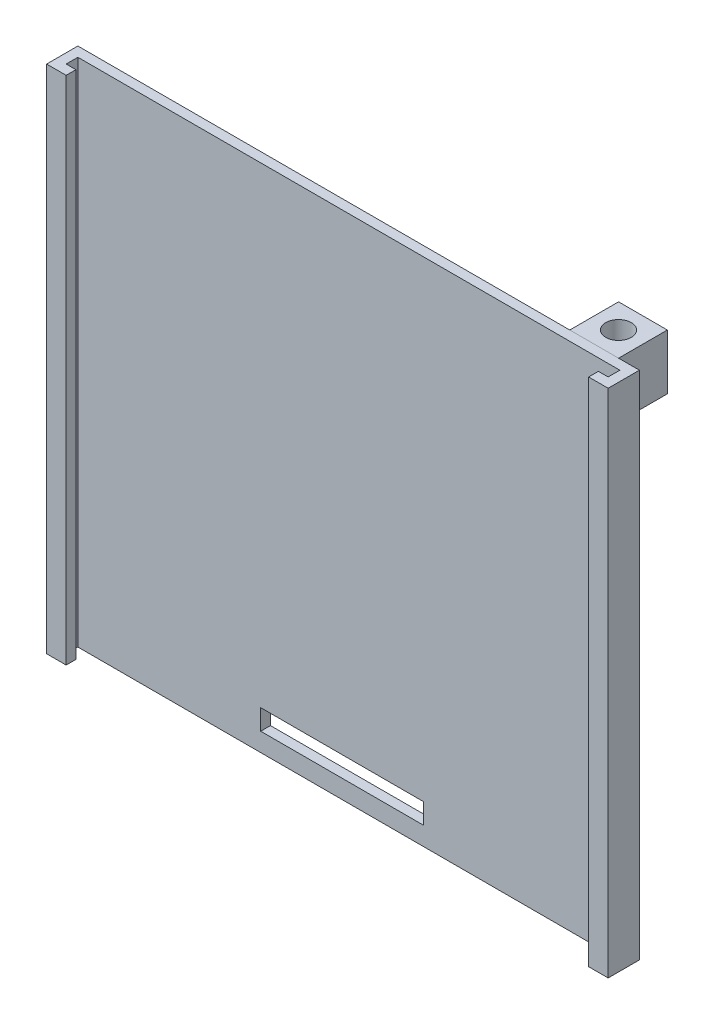
ISO-10303-21;
HEADER;
FILE_DESCRIPTION(('STEP AP214'),'2;1');
FILE_NAME('part.step','',(''),(''),'','','');
FILE_SCHEMA(('AUTOMOTIVE_DESIGN { 1 0 10303 214 1 1 1 1 }'));
ENDSEC;
DATA;
#1=APPLICATION_CONTEXT('core data for automotive mechanical design processes');
#2=APPLICATION_PROTOCOL_DEFINITION('international standard','automotive_design',2000,#1);
#3=PRODUCT_CONTEXT('',#1,'mechanical');
#4=PRODUCT('Part','Part','',(#3));
#5=PRODUCT_RELATED_PRODUCT_CATEGORY('part','',(#4));
#6=PRODUCT_DEFINITION_FORMATION('','',#4);
#7=PRODUCT_DEFINITION_CONTEXT('part definition',#1,'design');
#8=PRODUCT_DEFINITION('design','',#6,#7);
#9=PRODUCT_DEFINITION_SHAPE('','',#8);
#10=(LENGTH_UNIT() NAMED_UNIT(*) SI_UNIT(.MILLI.,.METRE.));
#11=(NAMED_UNIT(*) PLANE_ANGLE_UNIT() SI_UNIT($,.RADIAN.));
#12=(NAMED_UNIT(*) SI_UNIT($,.STERADIAN.) SOLID_ANGLE_UNIT());
#13=UNCERTAINTY_MEASURE_WITH_UNIT(LENGTH_MEASURE(1.E-05),#10,'distance_accuracy_value','');
#14=(GEOMETRIC_REPRESENTATION_CONTEXT(3) GLOBAL_UNCERTAINTY_ASSIGNED_CONTEXT((#13)) GLOBAL_UNIT_ASSIGNED_CONTEXT((#10,
#11,#12)) REPRESENTATION_CONTEXT('',''));
#15=CARTESIAN_POINT('',(0.,0.,0.));
#16=DIRECTION('',(0.,0.,1.));
#17=DIRECTION('',(1.,0.,0.));
#18=AXIS2_PLACEMENT_3D('',#15,#16,#17);
#19=CARTESIAN_POINT('',(101.473,97.79,-19.05));
#20=DIRECTION('',(-1.,0.,0.));
#21=DIRECTION('',(0.,0.,1.));
#22=AXIS2_PLACEMENT_3D('',#19,#20,#21);
#23=PLANE('',#22);
#24=DIRECTION('',(0.,-1.,0.));
#25=VECTOR('',#24,1.);
#26=CARTESIAN_POINT('',(101.473,97.79,0.));
#27=LINE('',#26,#25);
#28=CARTESIAN_POINT('',(101.473,97.79,0.));
#29=VERTEX_POINT('',#28);
#30=CARTESIAN_POINT('',(101.473,76.2,0.));
#31=VERTEX_POINT('',#30);
#32=EDGE_CURVE('E118',#29,#31,#27,.T.);
#33=ORIENTED_EDGE('',*,*,#32,.T.);
#34=DIRECTION('',(0.,0.,1.));
#35=VECTOR('',#34,1.);
#36=CARTESIAN_POINT('',(101.473,76.2,-19.05));
#37=LINE('',#36,#35);
#38=CARTESIAN_POINT('',(101.473,76.2,-19.05));
#39=VERTEX_POINT('',#38);
#40=EDGE_CURVE('E12',#39,#31,#37,.T.);
#41=ORIENTED_EDGE('',*,*,#40,.F.);
#42=DIRECTION('',(0.,-1.,0.));
#43=VECTOR('',#42,1.);
#44=CARTESIAN_POINT('',(101.473,97.79,-19.05));
#45=LINE('',#44,#43);
#46=CARTESIAN_POINT('',(101.473,97.79,-19.05));
#47=VERTEX_POINT('',#46);
#48=EDGE_CURVE('E106',#47,#39,#45,.T.);
#49=ORIENTED_EDGE('',*,*,#48,.F.);
#50=DIRECTION('',(0.,0.,1.));
#51=VECTOR('',#50,1.);
#52=CARTESIAN_POINT('',(101.473,97.79,-19.05));
#53=LINE('',#52,#51);
#54=EDGE_CURVE('E114',#47,#29,#53,.T.);
#55=ORIENTED_EDGE('',*,*,#54,.T.);
#56=EDGE_LOOP('',(#33,#41,#49,#55));
#57=FACE_BOUND('',#56,.T.);
#58=ADVANCED_FACE('F55',(#57),#23,.F.);
#59=CARTESIAN_POINT('',(101.473,76.2,-19.05));
#60=DIRECTION('',(0.,1.,0.));
#61=DIRECTION('',(0.,0.,1.));
#62=AXIS2_PLACEMENT_3D('',#59,#60,#61);
#63=PLANE('',#62);
#64=CARTESIAN_POINT('',(91.948,76.2,-9.52500000000024));
#65=DIRECTION('',(0.,1.,0.));
#66=DIRECTION('',(0.,0.,1.));
#67=AXIS2_PLACEMENT_3D('',#64,#65,#66);
#68=CIRCLE('',#67,5.);
#69=CARTESIAN_POINT('',(91.948,76.2,-4.52500000000024));
#70=VERTEX_POINT('',#69);
#71=EDGE_CURVE('E121',#70,#70,#68,.T.);
#72=ORIENTED_EDGE('',*,*,#71,.T.);
#73=EDGE_LOOP('',(#72));
#74=FACE_BOUND('',#73,.T.);
#75=DIRECTION('',(-1.,0.,0.));
#76=VECTOR('',#75,1.);
#77=CARTESIAN_POINT('',(101.473,76.2,0.));
#78=LINE('',#77,#76);
#79=CARTESIAN_POINT('',(82.423,76.2,0.));
#80=VERTEX_POINT('',#79);
#81=EDGE_CURVE('E110',#31,#80,#78,.T.);
#82=ORIENTED_EDGE('',*,*,#81,.T.);
#83=DIRECTION('',(0.,0.,1.));
#84=VECTOR('',#83,1.);
#85=CARTESIAN_POINT('',(82.423,76.2,-19.05));
#86=LINE('',#85,#84);
#87=CARTESIAN_POINT('',(82.423,76.2,-19.05));
#88=VERTEX_POINT('',#87);
#89=EDGE_CURVE('E63',#88,#80,#86,.T.);
#90=ORIENTED_EDGE('',*,*,#89,.F.);
#91=DIRECTION('',(-1.,0.,0.));
#92=VECTOR('',#91,1.);
#93=CARTESIAN_POINT('',(101.473,76.2,-19.05));
#94=LINE('',#93,#92);
#95=EDGE_CURVE('E101',#39,#88,#94,.T.);
#96=ORIENTED_EDGE('',*,*,#95,.F.);
#97=ORIENTED_EDGE('',*,*,#40,.T.);
#98=EDGE_LOOP('',(#82,#90,#96,#97));
#99=FACE_BOUND('',#98,.T.);
#100=ADVANCED_FACE('F109',(#74,#99),#63,.F.);
#101=CARTESIAN_POINT('',(82.423,97.79,-19.05));
#102=DIRECTION('',(1.,0.,0.));
#103=DIRECTION('',(0.,0.,-1.));
#104=AXIS2_PLACEMENT_3D('',#101,#102,#103);
#105=PLANE('',#104);
#106=DIRECTION('',(0.,1.,0.));
#107=VECTOR('',#106,1.);
#108=CARTESIAN_POINT('',(82.423,97.79,0.));
#109=LINE('',#108,#107);
#110=CARTESIAN_POINT('',(82.423,97.79,0.));
#111=VERTEX_POINT('',#110);
#112=EDGE_CURVE('E88',#80,#111,#109,.T.);
#113=ORIENTED_EDGE('',*,*,#112,.T.);
#114=DIRECTION('',(0.,0.,1.));
#115=VECTOR('',#114,1.);
#116=CARTESIAN_POINT('',(82.423,97.79,-19.05));
#117=LINE('',#116,#115);
#118=CARTESIAN_POINT('',(82.423,97.79,-19.05));
#119=VERTEX_POINT('',#118);
#120=EDGE_CURVE('E111',#119,#111,#117,.T.);
#121=ORIENTED_EDGE('',*,*,#120,.F.);
#122=DIRECTION('',(0.,1.,0.));
#123=VECTOR('',#122,1.);
#124=CARTESIAN_POINT('',(82.423,97.79,-19.05));
#125=LINE('',#124,#123);
#126=EDGE_CURVE('E104',#88,#119,#125,.T.);
#127=ORIENTED_EDGE('',*,*,#126,.F.);
#128=ORIENTED_EDGE('',*,*,#89,.T.);
#129=EDGE_LOOP('',(#113,#121,#127,#128));
#130=FACE_BOUND('',#129,.T.);
#131=ADVANCED_FACE('F112',(#130),#105,.F.);
#132=CARTESIAN_POINT('',(101.473,97.79,-19.05));
#133=DIRECTION('',(0.,-1.,0.));
#134=DIRECTION('',(0.,0.,-1.));
#135=AXIS2_PLACEMENT_3D('',#132,#133,#134);
#136=PLANE('',#135);
#137=CARTESIAN_POINT('',(91.948,97.79,-9.52500000000024));
#138=DIRECTION('',(0.,1.,0.));
#139=DIRECTION('',(0.,0.,1.));
#140=AXIS2_PLACEMENT_3D('',#137,#138,#139);
#141=CIRCLE('',#140,5.);
#142=CARTESIAN_POINT('',(91.948,97.79,-4.52500000000024));
#143=VERTEX_POINT('',#142);
#144=EDGE_CURVE('E132',#143,#143,#141,.T.);
#145=ORIENTED_EDGE('',*,*,#144,.F.);
#146=EDGE_LOOP('',(#145));
#147=FACE_BOUND('',#146,.T.);
#148=DIRECTION('',(1.,0.,0.));
#149=VECTOR('',#148,1.);
#150=CARTESIAN_POINT('',(101.473,97.79,0.));
#151=LINE('',#150,#149);
#152=EDGE_CURVE('E94',#111,#29,#151,.T.);
#153=ORIENTED_EDGE('',*,*,#152,.T.);
#154=ORIENTED_EDGE('',*,*,#54,.F.);
#155=DIRECTION('',(1.,0.,0.));
#156=VECTOR('',#155,1.);
#157=CARTESIAN_POINT('',(101.473,97.79,-19.05));
#158=LINE('',#157,#156);
#159=EDGE_CURVE('E71',#119,#47,#158,.T.);
#160=ORIENTED_EDGE('',*,*,#159,.F.);
#161=ORIENTED_EDGE('',*,*,#120,.T.);
#162=EDGE_LOOP('',(#153,#154,#160,#161));
#163=FACE_BOUND('',#162,.T.);
#164=ADVANCED_FACE('F126',(#147,#163),#136,.F.);
#165=CARTESIAN_POINT('',(0.,0.,-19.05));
#166=DIRECTION('',(0.,0.,-1.));
#167=DIRECTION('',(-1.,0.,0.));
#168=AXIS2_PLACEMENT_3D('',#165,#166,#167);
#169=PLANE('',#168);
#170=ORIENTED_EDGE('',*,*,#48,.T.);
#171=ORIENTED_EDGE('',*,*,#95,.T.);
#172=ORIENTED_EDGE('',*,*,#126,.T.);
#173=ORIENTED_EDGE('',*,*,#159,.T.);
#174=EDGE_LOOP('',(#170,#171,#172,#173));
#175=FACE_BOUND('',#174,.T.);
#176=ADVANCED_FACE('F102',(#175),#169,.T.);
#177=CARTESIAN_POINT('',(0.,0.,0.));
#178=DIRECTION('',(0.,0.,-1.));
#179=DIRECTION('',(-1.,0.,0.));
#180=AXIS2_PLACEMENT_3D('',#177,#178,#179);
#181=PLANE('',#180);
#182=ORIENTED_EDGE('',*,*,#32,.F.);
#183=ORIENTED_EDGE('',*,*,#152,.F.);
#184=ORIENTED_EDGE('',*,*,#112,.F.);
#185=ORIENTED_EDGE('',*,*,#81,.F.);
#186=EDGE_LOOP('',(#182,#183,#184,#185));
#187=FACE_BOUND('',#186,.T.);
#188=ADVANCED_FACE('F129',(#187),#181,.F.);
#189=CARTESIAN_POINT('',(91.948,76.2,-9.52500000000024));
#190=DIRECTION('',(0.,1.,0.));
#191=DIRECTION('',(0.,0.,1.));
#192=AXIS2_PLACEMENT_3D('',#189,#190,#191);
#193=CYLINDRICAL_SURFACE('',#192,5.);
#194=ORIENTED_EDGE('',*,*,#71,.F.);
#195=EDGE_LOOP('',(#194));
#196=FACE_BOUND('',#195,.T.);
#197=ORIENTED_EDGE('',*,*,#144,.T.);
#198=EDGE_LOOP('',(#197));
#199=FACE_BOUND('',#198,.T.);
#200=ADVANCED_FACE('F139',(#196,#199),#193,.F.);
#201=CLOSED_SHELL('',(#58,#100,#131,#164,#176,#188,#200));
#202=MANIFOLD_SOLID_BREP('B2',#201);
#203=CARTESIAN_POINT('',(0.,0.,3.81));
#204=DIRECTION('',(0.,0.,-1.));
#205=DIRECTION('',(-1.,0.,0.));
#206=AXIS2_PLACEMENT_3D('',#203,#204,#205);
#207=PLANE('',#206);
#208=DIRECTION('',(1.,0.,0.));
#209=VECTOR('',#208,1.);
#210=CARTESIAN_POINT('',(0.,97.79,3.81));
#211=LINE('',#210,#209);
#212=CARTESIAN_POINT('',(-105.791,97.79,3.81));
#213=VERTEX_POINT('',#212);
#214=CARTESIAN_POINT('',(105.791,97.79,3.81));
#215=VERTEX_POINT('',#214);
#216=EDGE_CURVE('E377',#213,#215,#211,.T.);
#217=ORIENTED_EDGE('',*,*,#216,.F.);
#218=DIRECTION('',(0.,-1.,0.));
#219=VECTOR('',#218,1.);
#220=CARTESIAN_POINT('',(-105.791,-101.6,3.81));
#221=LINE('',#220,#219);
#222=CARTESIAN_POINT('',(-105.791,-101.6,3.81));
#223=VERTEX_POINT('',#222);
#224=EDGE_CURVE('E471',#213,#223,#221,.T.);
#225=ORIENTED_EDGE('',*,*,#224,.T.);
#226=DIRECTION('',(1.,0.,0.));
#227=VECTOR('',#226,1.);
#228=CARTESIAN_POINT('',(-105.791,-101.6,3.81));
#229=LINE('',#228,#227);
#230=CARTESIAN_POINT('',(105.791,-101.6,3.81));
#231=VERTEX_POINT('',#230);
#232=EDGE_CURVE('E209',#223,#231,#229,.T.);
#233=ORIENTED_EDGE('',*,*,#232,.T.);
#234=DIRECTION('',(0.,1.,0.));
#235=VECTOR('',#234,1.);
#236=CARTESIAN_POINT('',(105.791,-101.6,3.81));
#237=LINE('',#236,#235);
#238=EDGE_CURVE('E467',#231,#215,#237,.T.);
#239=ORIENTED_EDGE('',*,*,#238,.T.);
#240=EDGE_LOOP('',(#217,#225,#233,#239));
#241=FACE_BOUND('',#240,.T.);
#242=DIRECTION('',(-1.,0.,0.));
#243=VECTOR('',#242,1.);
#244=CARTESIAN_POINT('',(29.083,-86.4083095041012,3.81));
#245=LINE('',#244,#243);
#246=CARTESIAN_POINT('',(29.083,-86.4083095041012,3.81));
#247=VERTEX_POINT('',#246);
#248=CARTESIAN_POINT('',(-34.417,-86.4083095041012,3.81));
#249=VERTEX_POINT('',#248);
#250=EDGE_CURVE('E313',#247,#249,#245,.T.);
#251=ORIENTED_EDGE('',*,*,#250,.F.);
#252=DIRECTION('',(0.,1.,0.));
#253=VECTOR('',#252,1.);
#254=CARTESIAN_POINT('',(29.083,-94.3749514775518,3.81));
#255=LINE('',#254,#253);
#256=CARTESIAN_POINT('',(29.083,-94.3749514775518,3.81));
#257=VERTEX_POINT('',#256);
#258=EDGE_CURVE('E338',#257,#247,#255,.T.);
#259=ORIENTED_EDGE('',*,*,#258,.F.);
#260=DIRECTION('',(-1.,0.,0.));
#261=VECTOR('',#260,1.);
#262=CARTESIAN_POINT('',(29.083,-94.3749514775518,3.81));
#263=LINE('',#262,#261);
#264=CARTESIAN_POINT('',(-34.417,-94.3749514775518,3.81));
#265=VERTEX_POINT('',#264);
#266=EDGE_CURVE('E216',#257,#265,#263,.T.);
#267=ORIENTED_EDGE('',*,*,#266,.T.);
#268=DIRECTION('',(0.,1.,0.));
#269=VECTOR('',#268,1.);
#270=CARTESIAN_POINT('',(-34.417,-94.3749514775518,3.81));
#271=LINE('',#270,#269);
#272=EDGE_CURVE('E323',#265,#249,#271,.T.);
#273=ORIENTED_EDGE('',*,*,#272,.T.);
#274=EDGE_LOOP('',(#251,#259,#267,#273));
#275=FACE_BOUND('',#274,.T.);
#276=ADVANCED_FACE('F200',(#241,#275),#207,.F.);
#277=CARTESIAN_POINT('',(0.,0.,0.));
#278=DIRECTION('',(0.,0.,-1.));
#279=DIRECTION('',(-1.,0.,0.));
#280=AXIS2_PLACEMENT_3D('',#277,#278,#279);
#281=PLANE('',#280);
#282=DIRECTION('',(0.,-1.,0.));
#283=VECTOR('',#282,1.);
#284=CARTESIAN_POINT('',(-109.601,101.6,0.));
#285=LINE('',#284,#283);
#286=CARTESIAN_POINT('',(-109.601,97.79,0.));
#287=VERTEX_POINT('',#286);
#288=CARTESIAN_POINT('',(-109.601,-101.6,0.));
#289=VERTEX_POINT('',#288);
#290=EDGE_CURVE('E449',#287,#289,#285,.T.);
#291=ORIENTED_EDGE('',*,*,#290,.F.);
#292=DIRECTION('',(1.,0.,0.));
#293=VECTOR('',#292,1.);
#294=CARTESIAN_POINT('',(0.,97.79,0.));
#295=LINE('',#294,#293);
#296=CARTESIAN_POINT('',(109.601,97.79,0.));
#297=VERTEX_POINT('',#296);
#298=EDGE_CURVE('E373',#287,#297,#295,.T.);
#299=ORIENTED_EDGE('',*,*,#298,.T.);
#300=DIRECTION('',(0.,1.,0.));
#301=VECTOR('',#300,1.);
#302=CARTESIAN_POINT('',(109.601,101.6,0.));
#303=LINE('',#302,#301);
#304=CARTESIAN_POINT('',(109.601,-101.6,0.));
#305=VERTEX_POINT('',#304);
#306=EDGE_CURVE('E432',#305,#297,#303,.T.);
#307=ORIENTED_EDGE('',*,*,#306,.F.);
#308=DIRECTION('',(1.,0.,0.));
#309=VECTOR('',#308,1.);
#310=CARTESIAN_POINT('',(-105.791,-101.6,0.));
#311=LINE('',#310,#309);
#312=EDGE_CURVE('E466',#289,#305,#311,.T.);
#313=ORIENTED_EDGE('',*,*,#312,.F.);
#314=EDGE_LOOP('',(#291,#299,#307,#313));
#315=FACE_BOUND('',#314,.T.);
#316=DIRECTION('',(0.,1.,0.));
#317=VECTOR('',#316,1.);
#318=CARTESIAN_POINT('',(29.083,-94.3749514775518,0.));
#319=LINE('',#318,#317);
#320=CARTESIAN_POINT('',(29.083,-94.3749514775518,0.));
#321=VERTEX_POINT('',#320);
#322=CARTESIAN_POINT('',(29.083,-86.4083095041012,0.));
#323=VERTEX_POINT('',#322);
#324=EDGE_CURVE('E324',#321,#323,#319,.T.);
#325=ORIENTED_EDGE('',*,*,#324,.T.);
#326=DIRECTION('',(-1.,0.,0.));
#327=VECTOR('',#326,1.);
#328=CARTESIAN_POINT('',(29.083,-86.4083095041012,0.));
#329=LINE('',#328,#327);
#330=CARTESIAN_POINT('',(-34.417,-86.4083095041012,0.));
#331=VERTEX_POINT('',#330);
#332=EDGE_CURVE('E224',#323,#331,#329,.T.);
#333=ORIENTED_EDGE('',*,*,#332,.T.);
#334=DIRECTION('',(0.,1.,0.));
#335=VECTOR('',#334,1.);
#336=CARTESIAN_POINT('',(-34.417,-94.3749514775518,0.));
#337=LINE('',#336,#335);
#338=CARTESIAN_POINT('',(-34.417,-94.3749514775518,0.));
#339=VERTEX_POINT('',#338);
#340=EDGE_CURVE('E330',#339,#331,#337,.T.);
#341=ORIENTED_EDGE('',*,*,#340,.F.);
#342=DIRECTION('',(-1.,0.,0.));
#343=VECTOR('',#342,1.);
#344=CARTESIAN_POINT('',(29.083,-94.3749514775518,0.));
#345=LINE('',#344,#343);
#346=EDGE_CURVE('E347',#321,#339,#345,.T.);
#347=ORIENTED_EDGE('',*,*,#346,.F.);
#348=EDGE_LOOP('',(#325,#333,#341,#347));
#349=FACE_BOUND('',#348,.T.);
#350=ADVANCED_FACE('F490',(#315,#349),#281,.T.);
#351=CARTESIAN_POINT('',(-105.791,0.,0.));
#352=DIRECTION('',(-1.,0.,0.));
#353=DIRECTION('',(0.,0.,1.));
#354=AXIS2_PLACEMENT_3D('',#351,#352,#353);
#355=PLANE('',#354);
#356=DIRECTION('',(0.,0.,-1.));
#357=VECTOR('',#356,1.);
#358=CARTESIAN_POINT('',(-105.791,97.79,0.));
#359=LINE('',#358,#357);
#360=CARTESIAN_POINT('',(-105.791,97.79,8.382));
#361=VERTEX_POINT('',#360);
#362=EDGE_CURVE('E366',#361,#213,#359,.T.);
#363=ORIENTED_EDGE('',*,*,#362,.F.);
#364=DIRECTION('',(0.,1.,0.));
#365=VECTOR('',#364,1.);
#366=CARTESIAN_POINT('',(-105.791,101.6,8.382));
#367=LINE('',#366,#365);
#368=CARTESIAN_POINT('',(-105.791,-101.6,8.38199999999998));
#369=VERTEX_POINT('',#368);
#370=EDGE_CURVE('E396',#369,#361,#367,.T.);
#371=ORIENTED_EDGE('',*,*,#370,.F.);
#372=DIRECTION('',(0.,0.,1.));
#373=VECTOR('',#372,1.);
#374=CARTESIAN_POINT('',(-105.791,-101.6,0.));
#375=LINE('',#374,#373);
#376=EDGE_CURVE('E448',#223,#369,#375,.T.);
#377=ORIENTED_EDGE('',*,*,#376,.F.);
#378=ORIENTED_EDGE('',*,*,#224,.F.);
#379=EDGE_LOOP('',(#363,#371,#377,#378));
#380=FACE_BOUND('',#379,.T.);
#381=ADVANCED_FACE('F514',(#380),#355,.F.);
#382=CARTESIAN_POINT('',(105.791,0.,0.));
#383=DIRECTION('',(-1.,0.,0.));
#384=DIRECTION('',(0.,0.,1.));
#385=AXIS2_PLACEMENT_3D('',#382,#383,#384);
#386=PLANE('',#385);
#387=DIRECTION('',(0.,-1.,0.));
#388=VECTOR('',#387,1.);
#389=CARTESIAN_POINT('',(105.791,101.6,8.382));
#390=LINE('',#389,#388);
#391=CARTESIAN_POINT('',(105.791,97.79,8.38200000000002));
#392=VERTEX_POINT('',#391);
#393=CARTESIAN_POINT('',(105.791,-101.6,8.38200000000002));
#394=VERTEX_POINT('',#393);
#395=EDGE_CURVE('E413',#392,#394,#390,.T.);
#396=ORIENTED_EDGE('',*,*,#395,.F.);
#397=DIRECTION('',(0.,0.,-1.));
#398=VECTOR('',#397,1.);
#399=CARTESIAN_POINT('',(105.791,97.79,0.));
#400=LINE('',#399,#398);
#401=EDGE_CURVE('E380',#392,#215,#400,.T.);
#402=ORIENTED_EDGE('',*,*,#401,.T.);
#403=ORIENTED_EDGE('',*,*,#238,.F.);
#404=DIRECTION('',(0.,0.,-1.));
#405=VECTOR('',#404,1.);
#406=CARTESIAN_POINT('',(105.791,-101.6,0.));
#407=LINE('',#406,#405);
#408=EDGE_CURVE('E431',#394,#231,#407,.T.);
#409=ORIENTED_EDGE('',*,*,#408,.F.);
#410=EDGE_LOOP('',(#396,#402,#403,#409));
#411=FACE_BOUND('',#410,.T.);
#412=ADVANCED_FACE('F522',(#411),#386,.T.);
#413=CARTESIAN_POINT('',(-109.601,101.6,12.192));
#414=DIRECTION('',(0.,0.,-1.));
#415=DIRECTION('',(0.,1.,0.));
#416=AXIS2_PLACEMENT_3D('',#413,#414,#415);
#417=PLANE('',#416);
#418=DIRECTION('',(1.,0.,0.));
#419=VECTOR('',#418,1.);
#420=CARTESIAN_POINT('',(-109.601,97.79,12.192));
#421=LINE('',#420,#419);
#422=CARTESIAN_POINT('',(-109.601,97.79,12.192));
#423=VERTEX_POINT('',#422);
#424=CARTESIAN_POINT('',(-101.981,97.79,12.192));
#425=VERTEX_POINT('',#424);
#426=EDGE_CURVE('E363',#423,#425,#421,.T.);
#427=ORIENTED_EDGE('',*,*,#426,.F.);
#428=DIRECTION('',(0.,1.,0.));
#429=VECTOR('',#428,1.);
#430=CARTESIAN_POINT('',(-109.601,101.6,12.192));
#431=LINE('',#430,#429);
#432=CARTESIAN_POINT('',(-109.601,-101.6,12.192));
#433=VERTEX_POINT('',#432);
#434=EDGE_CURVE('E455',#433,#423,#431,.T.);
#435=ORIENTED_EDGE('',*,*,#434,.F.);
#436=DIRECTION('',(1.,0.,0.));
#437=VECTOR('',#436,1.);
#438=CARTESIAN_POINT('',(-109.601,-101.6,12.192));
#439=LINE('',#438,#437);
#440=CARTESIAN_POINT('',(-101.981,-101.6,12.192));
#441=VERTEX_POINT('',#440);
#442=EDGE_CURVE('E459',#433,#441,#439,.T.);
#443=ORIENTED_EDGE('',*,*,#442,.T.);
#444=DIRECTION('',(0.,-1.,0.));
#445=VECTOR('',#444,1.);
#446=CARTESIAN_POINT('',(-101.981,101.6,12.192));
#447=LINE('',#446,#445);
#448=EDGE_CURVE('E397',#425,#441,#447,.T.);
#449=ORIENTED_EDGE('',*,*,#448,.F.);
#450=EDGE_LOOP('',(#427,#435,#443,#449));
#451=FACE_BOUND('',#450,.T.);
#452=ADVANCED_FACE('F499',(#451),#417,.F.);
#453=CARTESIAN_POINT('',(-109.601,0.,0.));
#454=DIRECTION('',(-1.,0.,0.));
#455=DIRECTION('',(0.,0.,1.));
#456=AXIS2_PLACEMENT_3D('',#453,#454,#455);
#457=PLANE('',#456);
#458=ORIENTED_EDGE('',*,*,#434,.T.);
#459=DIRECTION('',(0.,0.,-1.));
#460=VECTOR('',#459,1.);
#461=CARTESIAN_POINT('',(-109.601,97.79,0.));
#462=LINE('',#461,#460);
#463=EDGE_CURVE('E369',#423,#287,#462,.T.);
#464=ORIENTED_EDGE('',*,*,#463,.T.);
#465=ORIENTED_EDGE('',*,*,#290,.T.);
#466=DIRECTION('',(0.,0.,1.));
#467=VECTOR('',#466,1.);
#468=CARTESIAN_POINT('',(-109.601,-101.6,0.));
#469=LINE('',#468,#467);
#470=EDGE_CURVE('E452',#289,#433,#469,.T.);
#471=ORIENTED_EDGE('',*,*,#470,.T.);
#472=EDGE_LOOP('',(#458,#464,#465,#471));
#473=FACE_BOUND('',#472,.T.);
#474=ADVANCED_FACE('F496',(#473),#457,.T.);
#475=CARTESIAN_POINT('',(109.601,101.6,12.192));
#476=DIRECTION('',(0.,0.,-1.));
#477=DIRECTION('',(0.,1.,0.));
#478=AXIS2_PLACEMENT_3D('',#475,#476,#477);
#479=PLANE('',#478);
#480=DIRECTION('',(1.,0.,0.));
#481=VECTOR('',#480,1.);
#482=CARTESIAN_POINT('',(109.601,97.79,12.192));
#483=LINE('',#482,#481);
#484=CARTESIAN_POINT('',(101.981,97.79,12.192));
#485=VERTEX_POINT('',#484);
#486=CARTESIAN_POINT('',(109.601,97.79,12.192));
#487=VERTEX_POINT('',#486);
#488=EDGE_CURVE('E390',#485,#487,#483,.T.);
#489=ORIENTED_EDGE('',*,*,#488,.F.);
#490=DIRECTION('',(0.,1.,0.));
#491=VECTOR('',#490,1.);
#492=CARTESIAN_POINT('',(101.981,101.6,12.192));
#493=LINE('',#492,#491);
#494=CARTESIAN_POINT('',(101.981,-101.6,12.192));
#495=VERTEX_POINT('',#494);
#496=EDGE_CURVE('E414',#495,#485,#493,.T.);
#497=ORIENTED_EDGE('',*,*,#496,.F.);
#498=DIRECTION('',(-1.,0.,0.));
#499=VECTOR('',#498,1.);
#500=CARTESIAN_POINT('',(109.601,-101.6,12.192));
#501=LINE('',#500,#499);
#502=CARTESIAN_POINT('',(109.601,-101.6,12.192));
#503=VERTEX_POINT('',#502);
#504=EDGE_CURVE('E443',#503,#495,#501,.T.);
#505=ORIENTED_EDGE('',*,*,#504,.F.);
#506=DIRECTION('',(0.,-1.,0.));
#507=VECTOR('',#506,1.);
#508=CARTESIAN_POINT('',(109.601,101.6,12.192));
#509=LINE('',#508,#507);
#510=EDGE_CURVE('E436',#487,#503,#509,.T.);
#511=ORIENTED_EDGE('',*,*,#510,.F.);
#512=EDGE_LOOP('',(#489,#497,#505,#511));
#513=FACE_BOUND('',#512,.T.);
#514=ADVANCED_FACE('F535',(#513),#479,.F.);
#515=CARTESIAN_POINT('',(109.601,0.,0.));
#516=DIRECTION('',(-1.,0.,0.));
#517=DIRECTION('',(0.,0.,1.));
#518=AXIS2_PLACEMENT_3D('',#515,#516,#517);
#519=PLANE('',#518);
#520=DIRECTION('',(0.,0.,-1.));
#521=VECTOR('',#520,1.);
#522=CARTESIAN_POINT('',(109.601,97.79,0.));
#523=LINE('',#522,#521);
#524=EDGE_CURVE('E387',#487,#297,#523,.T.);
#525=ORIENTED_EDGE('',*,*,#524,.F.);
#526=ORIENTED_EDGE('',*,*,#510,.T.);
#527=DIRECTION('',(0.,0.,-1.));
#528=VECTOR('',#527,1.);
#529=CARTESIAN_POINT('',(109.601,-101.6,0.));
#530=LINE('',#529,#528);
#531=EDGE_CURVE('E439',#503,#305,#530,.T.);
#532=ORIENTED_EDGE('',*,*,#531,.T.);
#533=ORIENTED_EDGE('',*,*,#306,.T.);
#534=EDGE_LOOP('',(#525,#526,#532,#533));
#535=FACE_BOUND('',#534,.T.);
#536=ADVANCED_FACE('F487',(#535),#519,.F.);
#537=CARTESIAN_POINT('',(101.981,101.6,8.382));
#538=DIRECTION('',(0.,0.,1.));
#539=DIRECTION('',(0.,-1.,0.));
#540=AXIS2_PLACEMENT_3D('',#537,#538,#539);
#541=PLANE('',#540);
#542=DIRECTION('',(-1.,0.,0.));
#543=VECTOR('',#542,1.);
#544=CARTESIAN_POINT('',(101.981,97.79,8.382));
#545=LINE('',#544,#543);
#546=CARTESIAN_POINT('',(101.981,97.79,8.382));
#547=VERTEX_POINT('',#546);
#548=EDGE_CURVE('E384',#392,#547,#545,.T.);
#549=ORIENTED_EDGE('',*,*,#548,.F.);
#550=ORIENTED_EDGE('',*,*,#395,.T.);
#551=DIRECTION('',(1.,0.,0.));
#552=VECTOR('',#551,1.);
#553=CARTESIAN_POINT('',(101.981,-101.6,8.38200000000002));
#554=LINE('',#553,#552);
#555=CARTESIAN_POINT('',(101.981,-101.6,8.38200000000002));
#556=VERTEX_POINT('',#555);
#557=EDGE_CURVE('E425',#556,#394,#554,.T.);
#558=ORIENTED_EDGE('',*,*,#557,.F.);
#559=DIRECTION('',(0.,-1.,0.));
#560=VECTOR('',#559,1.);
#561=CARTESIAN_POINT('',(101.981,101.6,8.382));
#562=LINE('',#561,#560);
#563=EDGE_CURVE('E418',#547,#556,#562,.T.);
#564=ORIENTED_EDGE('',*,*,#563,.F.);
#565=EDGE_LOOP('',(#549,#550,#558,#564));
#566=FACE_BOUND('',#565,.T.);
#567=ADVANCED_FACE('F526',(#566),#541,.F.);
#568=CARTESIAN_POINT('',(101.981,0.,0.));
#569=DIRECTION('',(1.,0.,0.));
#570=DIRECTION('',(0.,0.,-1.));
#571=AXIS2_PLACEMENT_3D('',#568,#569,#570);
#572=PLANE('',#571);
#573=DIRECTION('',(0.,0.,1.));
#574=VECTOR('',#573,1.);
#575=CARTESIAN_POINT('',(101.981,97.79,0.));
#576=LINE('',#575,#574);
#577=EDGE_CURVE('E393',#547,#485,#576,.T.);
#578=ORIENTED_EDGE('',*,*,#577,.F.);
#579=ORIENTED_EDGE('',*,*,#563,.T.);
#580=DIRECTION('',(0.,0.,1.));
#581=VECTOR('',#580,1.);
#582=CARTESIAN_POINT('',(101.981,-101.6,12.192));
#583=LINE('',#582,#581);
#584=EDGE_CURVE('E421',#556,#495,#583,.T.);
#585=ORIENTED_EDGE('',*,*,#584,.T.);
#586=ORIENTED_EDGE('',*,*,#496,.T.);
#587=EDGE_LOOP('',(#578,#579,#585,#586));
#588=FACE_BOUND('',#587,.T.);
#589=ADVANCED_FACE('F532',(#588),#572,.F.);
#590=CARTESIAN_POINT('',(-101.981,101.6,8.382));
#591=DIRECTION('',(0.,0.,1.));
#592=DIRECTION('',(0.,-1.,0.));
#593=AXIS2_PLACEMENT_3D('',#590,#591,#592);
#594=PLANE('',#593);
#595=DIRECTION('',(-1.,0.,0.));
#596=VECTOR('',#595,1.);
#597=CARTESIAN_POINT('',(-101.981,97.79,8.382));
#598=LINE('',#597,#596);
#599=CARTESIAN_POINT('',(-101.981,97.79,8.38199999999998));
#600=VERTEX_POINT('',#599);
#601=EDGE_CURVE('E332',#600,#361,#598,.T.);
#602=ORIENTED_EDGE('',*,*,#601,.F.);
#603=DIRECTION('',(0.,1.,0.));
#604=VECTOR('',#603,1.);
#605=CARTESIAN_POINT('',(-101.981,101.6,8.382));
#606=LINE('',#605,#604);
#607=CARTESIAN_POINT('',(-101.981,-101.6,8.38199999999998));
#608=VERTEX_POINT('',#607);
#609=EDGE_CURVE('E403',#608,#600,#606,.T.);
#610=ORIENTED_EDGE('',*,*,#609,.F.);
#611=DIRECTION('',(-1.,0.,0.));
#612=VECTOR('',#611,1.);
#613=CARTESIAN_POINT('',(-101.981,-101.6,8.38199999999998));
#614=LINE('',#613,#612);
#615=EDGE_CURVE('E407',#608,#369,#614,.T.);
#616=ORIENTED_EDGE('',*,*,#615,.T.);
#617=ORIENTED_EDGE('',*,*,#370,.T.);
#618=EDGE_LOOP('',(#602,#610,#616,#617));
#619=FACE_BOUND('',#618,.T.);
#620=ADVANCED_FACE('F508',(#619),#594,.F.);
#621=CARTESIAN_POINT('',(-101.981,0.,0.));
#622=DIRECTION('',(1.,0.,0.));
#623=DIRECTION('',(0.,0.,-1.));
#624=AXIS2_PLACEMENT_3D('',#621,#622,#623);
#625=PLANE('',#624);
#626=ORIENTED_EDGE('',*,*,#609,.T.);
#627=DIRECTION('',(0.,0.,1.));
#628=VECTOR('',#627,1.);
#629=CARTESIAN_POINT('',(-101.981,97.79,0.));
#630=LINE('',#629,#628);
#631=EDGE_CURVE('E53',#600,#425,#630,.T.);
#632=ORIENTED_EDGE('',*,*,#631,.T.);
#633=ORIENTED_EDGE('',*,*,#448,.T.);
#634=DIRECTION('',(0.,0.,-1.));
#635=VECTOR('',#634,1.);
#636=CARTESIAN_POINT('',(-101.981,-101.6,12.192));
#637=LINE('',#636,#635);
#638=EDGE_CURVE('E400',#441,#608,#637,.T.);
#639=ORIENTED_EDGE('',*,*,#638,.T.);
#640=EDGE_LOOP('',(#626,#632,#633,#639));
#641=FACE_BOUND('',#640,.T.);
#642=ADVANCED_FACE('F504',(#641),#625,.T.);
#643=CARTESIAN_POINT('',(-105.791,-101.6,3.81));
#644=DIRECTION('',(0.,1.,0.));
#645=DIRECTION('',(0.,0.,1.));
#646=AXIS2_PLACEMENT_3D('',#643,#644,#645);
#647=PLANE('',#646);
#648=ORIENTED_EDGE('',*,*,#312,.T.);
#649=ORIENTED_EDGE('',*,*,#531,.F.);
#650=ORIENTED_EDGE('',*,*,#504,.T.);
#651=ORIENTED_EDGE('',*,*,#584,.F.);
#652=ORIENTED_EDGE('',*,*,#557,.T.);
#653=ORIENTED_EDGE('',*,*,#408,.T.);
#654=ORIENTED_EDGE('',*,*,#232,.F.);
#655=ORIENTED_EDGE('',*,*,#376,.T.);
#656=ORIENTED_EDGE('',*,*,#615,.F.);
#657=ORIENTED_EDGE('',*,*,#638,.F.);
#658=ORIENTED_EDGE('',*,*,#442,.F.);
#659=ORIENTED_EDGE('',*,*,#470,.F.);
#660=EDGE_LOOP('',(#648,#649,#650,#651,#652,#653,#654,#655,#656,#657,#658,#659));
#661=FACE_BOUND('',#660,.T.);
#662=ADVANCED_FACE('F202',(#661),#647,.F.);
#663=CARTESIAN_POINT('',(0.,97.79,0.));
#664=DIRECTION('',(0.,1.,0.));
#665=DIRECTION('',(0.,0.,1.));
#666=AXIS2_PLACEMENT_3D('',#663,#664,#665);
#667=PLANE('',#666);
#668=ORIENTED_EDGE('',*,*,#577,.T.);
#669=ORIENTED_EDGE('',*,*,#488,.T.);
#670=ORIENTED_EDGE('',*,*,#524,.T.);
#671=ORIENTED_EDGE('',*,*,#298,.F.);
#672=ORIENTED_EDGE('',*,*,#463,.F.);
#673=ORIENTED_EDGE('',*,*,#426,.T.);
#674=ORIENTED_EDGE('',*,*,#631,.F.);
#675=ORIENTED_EDGE('',*,*,#601,.T.);
#676=ORIENTED_EDGE('',*,*,#362,.T.);
#677=ORIENTED_EDGE('',*,*,#216,.T.);
#678=ORIENTED_EDGE('',*,*,#401,.F.);
#679=ORIENTED_EDGE('',*,*,#548,.T.);
#680=EDGE_LOOP('',(#668,#669,#670,#671,#672,#673,#674,#675,#676,#677,#678,#679));
#681=FACE_BOUND('',#680,.T.);
#682=ADVANCED_FACE('F493',(#681),#667,.T.);
#683=CARTESIAN_POINT('',(29.083,-86.4083095041012,3.81));
#684=DIRECTION('',(0.,-1.,0.));
#685=DIRECTION('',(0.,0.,-1.));
#686=AXIS2_PLACEMENT_3D('',#683,#684,#685);
#687=PLANE('',#686);
#688=ORIENTED_EDGE('',*,*,#332,.F.);
#689=DIRECTION('',(0.,0.,-1.));
#690=VECTOR('',#689,1.);
#691=CARTESIAN_POINT('',(29.083,-86.4083095041012,3.81));
#692=LINE('',#691,#690);
#693=EDGE_CURVE('E318',#247,#323,#692,.T.);
#694=ORIENTED_EDGE('',*,*,#693,.F.);
#695=ORIENTED_EDGE('',*,*,#250,.T.);
#696=DIRECTION('',(0.,0.,-1.));
#697=VECTOR('',#696,1.);
#698=CARTESIAN_POINT('',(-34.417,-86.4083095041012,3.81));
#699=LINE('',#698,#697);
#700=EDGE_CURVE('E316',#249,#331,#699,.T.);
#701=ORIENTED_EDGE('',*,*,#700,.T.);
#702=EDGE_LOOP('',(#688,#694,#695,#701));
#703=FACE_BOUND('',#702,.T.);
#704=ADVANCED_FACE('F315',(#703),#687,.T.);
#705=CARTESIAN_POINT('',(-34.417,-94.3749514775518,3.81));
#706=DIRECTION('',(-1.,0.,0.));
#707=DIRECTION('',(0.,0.,1.));
#708=AXIS2_PLACEMENT_3D('',#705,#706,#707);
#709=PLANE('',#708);
#710=ORIENTED_EDGE('',*,*,#340,.T.);
#711=ORIENTED_EDGE('',*,*,#700,.F.);
#712=ORIENTED_EDGE('',*,*,#272,.F.);
#713=DIRECTION('',(0.,0.,-1.));
#714=VECTOR('',#713,1.);
#715=CARTESIAN_POINT('',(-34.417,-94.3749514775518,3.81));
#716=LINE('',#715,#714);
#717=EDGE_CURVE('E333',#265,#339,#716,.T.);
#718=ORIENTED_EDGE('',*,*,#717,.T.);
#719=EDGE_LOOP('',(#710,#711,#712,#718));
#720=FACE_BOUND('',#719,.T.);
#721=ADVANCED_FACE('F328',(#720),#709,.F.);
#722=CARTESIAN_POINT('',(29.083,-94.3749514775518,3.81));
#723=DIRECTION('',(0.,-1.,0.));
#724=DIRECTION('',(0.,0.,-1.));
#725=AXIS2_PLACEMENT_3D('',#722,#723,#724);
#726=PLANE('',#725);
#727=ORIENTED_EDGE('',*,*,#346,.T.);
#728=ORIENTED_EDGE('',*,*,#717,.F.);
#729=ORIENTED_EDGE('',*,*,#266,.F.);
#730=DIRECTION('',(0.,0.,-1.));
#731=VECTOR('',#730,1.);
#732=CARTESIAN_POINT('',(29.083,-94.3749514775518,3.81));
#733=LINE('',#732,#731);
#734=EDGE_CURVE('E356',#257,#321,#733,.T.);
#735=ORIENTED_EDGE('',*,*,#734,.T.);
#736=EDGE_LOOP('',(#727,#728,#729,#735));
#737=FACE_BOUND('',#736,.T.);
#738=ADVANCED_FACE('F575',(#737),#726,.F.);
#739=CARTESIAN_POINT('',(29.083,-94.3749514775518,3.81));
#740=DIRECTION('',(-1.,0.,0.));
#741=DIRECTION('',(0.,0.,1.));
#742=AXIS2_PLACEMENT_3D('',#739,#740,#741);
#743=PLANE('',#742);
#744=ORIENTED_EDGE('',*,*,#324,.F.);
#745=ORIENTED_EDGE('',*,*,#734,.F.);
#746=ORIENTED_EDGE('',*,*,#258,.T.);
#747=ORIENTED_EDGE('',*,*,#693,.T.);
#748=EDGE_LOOP('',(#744,#745,#746,#747));
#749=FACE_BOUND('',#748,.T.);
#750=ADVANCED_FACE('F578',(#749),#743,.T.);
#751=CLOSED_SHELL('',(#276,#350,#381,#412,#452,#474,#514,#536,#567,#589,#620,#642,#662,#682,
#704,#721,#738,#750));
#752=MANIFOLD_SOLID_BREP('B6',#751);
#753=ADVANCED_BREP_SHAPE_REPRESENTATION('',(#18,#202,#752),#14);
#754=SHAPE_DEFINITION_REPRESENTATION(#9,#753);
ENDSEC;
END-ISO-10303-21;
